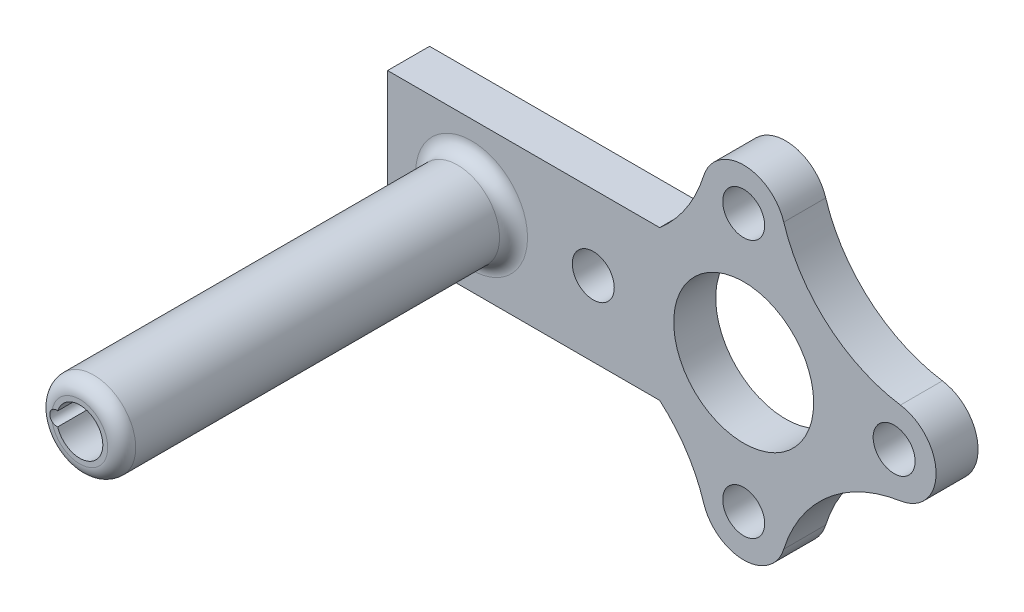
ISO-10303-21;
HEADER;
FILE_DESCRIPTION(('STEP AP214'),'2;1');
FILE_NAME('part.step','',(''),(''),'','','');
FILE_SCHEMA(('AUTOMOTIVE_DESIGN { 1 0 10303 214 1 1 1 1 }'));
ENDSEC;
DATA;
#1=APPLICATION_CONTEXT('core data for automotive mechanical design processes');
#2=APPLICATION_PROTOCOL_DEFINITION('international standard','automotive_design',2000,#1);
#3=PRODUCT_CONTEXT('',#1,'mechanical');
#4=PRODUCT('Part','Part','',(#3));
#5=PRODUCT_RELATED_PRODUCT_CATEGORY('part','',(#4));
#6=PRODUCT_DEFINITION_FORMATION('','',#4);
#7=PRODUCT_DEFINITION_CONTEXT('part definition',#1,'design');
#8=PRODUCT_DEFINITION('design','',#6,#7);
#9=PRODUCT_DEFINITION_SHAPE('','',#8);
#10=(LENGTH_UNIT() NAMED_UNIT(*) SI_UNIT(.MILLI.,.METRE.));
#11=(NAMED_UNIT(*) PLANE_ANGLE_UNIT() SI_UNIT($,.RADIAN.));
#12=(NAMED_UNIT(*) SI_UNIT($,.STERADIAN.) SOLID_ANGLE_UNIT());
#13=UNCERTAINTY_MEASURE_WITH_UNIT(LENGTH_MEASURE(1.E-05),#10,'distance_accuracy_value','');
#14=(GEOMETRIC_REPRESENTATION_CONTEXT(3) GLOBAL_UNCERTAINTY_ASSIGNED_CONTEXT((#13)) GLOBAL_UNIT_ASSIGNED_CONTEXT((#10,
#11,#12)) REPRESENTATION_CONTEXT('',''));
#15=CARTESIAN_POINT('',(0.,0.,0.));
#16=DIRECTION('',(0.,0.,1.));
#17=DIRECTION('',(1.,0.,0.));
#18=AXIS2_PLACEMENT_3D('',#15,#16,#17);
#19=CARTESIAN_POINT('',(-19.45,0.,0.));
#20=DIRECTION('',(0.,0.,1.));
#21=DIRECTION('',(1.,0.,0.));
#22=AXIS2_PLACEMENT_3D('',#19,#20,#21);
#23=CYLINDRICAL_SURFACE('',#22,1.65);
#24=CARTESIAN_POINT('',(-19.45,0.,2.));
#25=DIRECTION('',(0.,0.,-1.));
#26=DIRECTION('',(-1.,0.,0.));
#27=AXIS2_PLACEMENT_3D('',#24,#25,#26);
#28=CIRCLE('',#27,1.65);
#29=CARTESIAN_POINT('',(-21.0242424242424,-0.49422746758485,2.));
#30=VERTEX_POINT('',#29);
#31=CARTESIAN_POINT('',(-21.0242424242424,0.49422746758485,2.));
#32=VERTEX_POINT('',#31);
#33=EDGE_CURVE('E151',#30,#32,#28,.F.);
#34=ORIENTED_EDGE('',*,*,#33,.F.);
#35=DIRECTION('',(0.,0.,1.));
#36=VECTOR('',#35,1.);
#37=CARTESIAN_POINT('',(-21.0242424242424,-0.49422746758485,16.));
#38=LINE('',#37,#36);
#39=CARTESIAN_POINT('',(-21.0242424242424,-0.49422746758485,31.));
#40=VERTEX_POINT('',#39);
#41=EDGE_CURVE('E164',#30,#40,#38,.T.);
#42=ORIENTED_EDGE('',*,*,#41,.T.);
#43=CARTESIAN_POINT('',(-19.45,0.,31.));
#44=DIRECTION('',(0.,0.,1.));
#45=DIRECTION('',(1.,0.,0.));
#46=AXIS2_PLACEMENT_3D('',#43,#44,#45);
#47=CIRCLE('',#46,1.65);
#48=CARTESIAN_POINT('',(-21.0242424242424,0.49422746758485,31.));
#49=VERTEX_POINT('',#48);
#50=EDGE_CURVE('E173',#40,#49,#47,.T.);
#51=ORIENTED_EDGE('',*,*,#50,.T.);
#52=DIRECTION('',(0.,0.,1.));
#53=VECTOR('',#52,1.);
#54=CARTESIAN_POINT('',(-21.0242424242424,0.49422746758485,16.));
#55=LINE('',#54,#53);
#56=EDGE_CURVE('E166',#49,#32,#55,.F.);
#57=ORIENTED_EDGE('',*,*,#56,.T.);
#58=EDGE_LOOP('',(#34,#42,#51,#57));
#59=FACE_BOUND('',#58,.T.);
#60=ADVANCED_FACE('F46',(#59),#23,.F.);
#61=CARTESIAN_POINT('',(-21.1,0.,1.));
#62=DIRECTION('',(0.,0.,1.));
#63=DIRECTION('',(1.,0.,0.));
#64=AXIS2_PLACEMENT_3D('',#61,#62,#63);
#65=CYLINDRICAL_SURFACE('',#64,0.499999999999999);
#66=CARTESIAN_POINT('',(-21.1,0.,31.));
#67=DIRECTION('',(0.,0.,1.));
#68=DIRECTION('',(1.,0.,0.));
#69=AXIS2_PLACEMENT_3D('',#66,#67,#68);
#70=CIRCLE('',#69,0.499999999999999);
#71=CARTESIAN_POINT('',(-21.4113636363636,0.391219485647652,31.));
#72=VERTEX_POINT('',#71);
#73=EDGE_CURVE('E179',#49,#72,#70,.T.);
#74=ORIENTED_EDGE('',*,*,#73,.T.);
#75=CARTESIAN_POINT('',(-21.4113636363636,0.391219485647652,31.));
#76=CARTESIAN_POINT('',(-21.4333386085266,0.373759192446332,30.9999904788766));
#77=CARTESIAN_POINT('',(-21.4538006207845,0.354426202550446,30.9995066562345));
#78=CARTESIAN_POINT('',(-21.4911932018978,0.312645168823907,30.9980103081698));
#79=CARTESIAN_POINT('',(-21.5081265517639,0.290199601494244,30.9969982013206));
#80=CARTESIAN_POINT('',(-21.5379943465226,0.242791417093725,30.9948637190759));
#81=CARTESIAN_POINT('',(-21.5509283246198,0.217828506656292,30.9937413308287));
#82=CARTESIAN_POINT('',(-21.5724395578043,0.166087830484109,30.9917118296412));
#83=CARTESIAN_POINT('',(-21.5810176201198,0.139310402054949,30.9908046768305));
#84=CARTESIAN_POINT('',(-21.5935928420215,0.0845968457043598,30.9894317260018));
#85=CARTESIAN_POINT('',(-21.5975750850388,0.0566572480114473,30.988967365991));
#86=CARTESIAN_POINT('',(-21.600790074567,0.000500499319228724,30.988594598502));
#87=CARTESIAN_POINT('',(-21.6000225659482,-0.0277166665081785,30.988686220888));
#88=CARTESIAN_POINT('',(-21.5937813735543,-0.0834308114113578,30.9894017485214));
#89=CARTESIAN_POINT('',(-21.5883384303959,-0.110931288353157,30.9900221767058));
#90=CARTESIAN_POINT('',(-21.5729431739863,-0.164636629029002,30.9916441464587));
#91=CARTESIAN_POINT('',(-21.5629894092904,-0.190841072726625,30.9926458106807));
#92=CARTESIAN_POINT('',(-21.5388037995262,-0.241326751002398,30.9947751490887));
#93=CARTESIAN_POINT('',(-21.5245537342457,-0.265599226898945,30.9959033468351));
#94=CARTESIAN_POINT('',(-21.4921992443994,-0.311388276502147,30.9979256338297));
#95=CARTESIAN_POINT('',(-21.4741007384561,-0.332909001729001,30.9988200779183));
#96=CARTESIAN_POINT('',(-21.4407689563698,-0.366401510243679,30.9997681879898));
#97=CARTESIAN_POINT('',(-21.4264146654729,-0.379252491239132,30.9999974794818));
#98=CARTESIAN_POINT('',(-21.4113636363636,-0.391219485647658,31.));
#99=B_SPLINE_CURVE_WITH_KNOTS('',3,(#75,#76,#77,#78,#79,#80,#81,#82,#83,#84,#85,#86,#87,#88,#89,
#90,#91,#92,#93,#94,#95,#96,#97,#98),.UNSPECIFIED.,.F.,.F.,(4,2,2,2,2,2,2,2,2,2,2,4),(0.,
0.0840719847473638,0.168077457943229,0.252092732322253,0.336092431496281,0.420364006977041,
0.504640109086872,0.588366307009858,0.672119464616227,0.756232930839759,0.840217960367376,
0.897888808644791),.UNSPECIFIED.);
#100=CARTESIAN_POINT('',(-21.4113636363636,-0.391219485647652,31.));
#101=VERTEX_POINT('',#100);
#102=EDGE_CURVE('E56',#72,#101,#99,.T.);
#103=ORIENTED_EDGE('',*,*,#102,.T.);
#104=EDGE_CURVE('E168',#101,#40,#70,.T.);
#105=ORIENTED_EDGE('',*,*,#104,.T.);
#106=ORIENTED_EDGE('',*,*,#41,.F.);
#107=CARTESIAN_POINT('',(-21.1,0.,2.));
#108=DIRECTION('',(0.,0.,-1.));
#109=DIRECTION('',(-1.,0.,0.));
#110=AXIS2_PLACEMENT_3D('',#107,#108,#109);
#111=CIRCLE('',#110,0.499999999999999);
#112=CARTESIAN_POINT('',(-21.4113636363636,-0.391219485647664,2.));
#113=VERTEX_POINT('',#112);
#114=EDGE_CURVE('E147',#113,#30,#111,.F.);
#115=ORIENTED_EDGE('',*,*,#114,.F.);
#116=CARTESIAN_POINT('',(-21.4113636363636,-0.391219485647664,2.));
#117=CARTESIAN_POINT('',(-21.4308921485047,-0.375698748723737,1.98388420982419));
#118=CARTESIAN_POINT('',(-21.449723338062,-0.358300996107864,1.96854837000159));
#119=CARTESIAN_POINT('',(-21.485260021464,-0.31978413315132,1.93988834394156));
#120=CARTESIAN_POINT('',(-21.5019517323035,-0.298642797858754,1.92657710729837));
#121=CARTESIAN_POINT('',(-21.5299074837154,-0.256359666616134,1.90445735202498));
#122=CARTESIAN_POINT('',(-21.5416111051936,-0.235710531357668,1.89527167531953));
#123=CARTESIAN_POINT('',(-21.5621793458805,-0.192264734155432,1.87920859605277));
#124=CARTESIAN_POINT('',(-21.5710509214748,-0.169473515080711,1.87232553552208));
#125=CARTESIAN_POINT('',(-21.5855039651472,-0.12207882840306,1.86114633741173));
#126=CARTESIAN_POINT('',(-21.5910632709989,-0.0974643656635426,1.85686762134611));
#127=CARTESIAN_POINT('',(-21.5983973800872,-0.0473376368490403,1.85122833769585));
#128=CARTESIAN_POINT('',(-21.6001719641957,-0.0218253188769012,1.8498679390761));
#129=CARTESIAN_POINT('',(-21.5998206718191,0.0264742359867795,1.85013770315427));
#130=CARTESIAN_POINT('',(-21.5980833593503,0.0492673880406792,1.85146994372855));
#131=CARTESIAN_POINT('',(-21.5915797262114,0.0941445262998176,1.85647036834818));
#132=CARTESIAN_POINT('',(-21.586814165474,0.11622868896432,1.86013796634066));
#133=CARTESIAN_POINT('',(-21.5745638327234,0.159002766458833,1.86960504005227));
#134=CARTESIAN_POINT('',(-21.567093875793,0.179699563073462,1.87539290265807));
#135=CARTESIAN_POINT('',(-21.5498036471234,0.219423141026829,1.88886352023397));
#136=CARTESIAN_POINT('',(-21.5399823338818,0.238449177205474,1.89654711494002));
#137=CARTESIAN_POINT('',(-21.5172451067083,0.276493717182921,1.91445516320856));
#138=CARTESIAN_POINT('',(-21.5041106423672,0.295294109399724,1.92486340394062));
#139=CARTESIAN_POINT('',(-21.4760087112737,0.330336607620189,1.94732994676704));
#140=CARTESIAN_POINT('',(-21.4610413483606,0.346578858431284,1.95938815539022));
#141=CARTESIAN_POINT('',(-21.4343609934774,0.372069853678035,1.98109605184999));
#142=CARTESIAN_POINT('',(-21.4229897051886,0.381968568036632,1.99040755578535));
#143=CARTESIAN_POINT('',(-21.4113636363636,0.391219485647722,1.99999999999996));
#144=B_SPLINE_CURVE_WITH_KNOTS('',3,(#116,#117,#118,#119,#120,#121,#122,#123,#124,#125,#126,
#127,#128,#129,#130,#131,#132,#133,#134,#135,#136,#137,#138,#139,#140,#141,#142,#143),
.UNSPECIFIED.,.F.,.F.,(4,2,2,2,2,2,2,2,2,2,2,2,2,4),(0.,0.0891765680526609,0.178901486274257,
0.254930528184064,0.330771355916632,0.40711409241865,0.483461248897172,0.55182266918244,
0.620166941075376,0.688142341909253,0.756147907444155,0.831421336116651,0.906690502291091,
0.959765954082744),.UNSPECIFIED.);
#145=CARTESIAN_POINT('',(-21.4113636363636,0.391219485647664,2.));
#146=VERTEX_POINT('',#145);
#147=EDGE_CURVE('E335',#113,#146,#144,.T.);
#148=ORIENTED_EDGE('',*,*,#147,.T.);
#149=EDGE_CURVE('E157',#32,#146,#111,.F.);
#150=ORIENTED_EDGE('',*,*,#149,.F.);
#151=ORIENTED_EDGE('',*,*,#56,.F.);
#152=EDGE_LOOP('',(#74,#103,#105,#106,#115,#148,#150,#151));
#153=FACE_BOUND('',#152,.T.);
#154=ADVANCED_FACE('F171',(#153),#65,.F.);
#155=CARTESIAN_POINT('',(-12.7511833856394,-13.2080524548102,3.));
#156=DIRECTION('',(0.,0.,-1.));
#157=DIRECTION('',(-1.,0.,0.));
#158=AXIS2_PLACEMENT_3D('',#155,#156,#157);
#159=CYLINDRICAL_SURFACE('',#158,10.3587942791247);
#160=DIRECTION('',(0.,0.,-1.));
#161=VECTOR('',#160,1.);
#162=CARTESIAN_POINT('',(-6.00525389763348,-5.34694221133441,3.));
#163=LINE('',#162,#161);
#164=CARTESIAN_POINT('',(-6.00525389763348,-5.34694221133441,3.));
#165=VERTEX_POINT('',#164);
#166=CARTESIAN_POINT('',(-6.00525389763348,-5.34694221133441,0.));
#167=VERTEX_POINT('',#166);
#168=EDGE_CURVE('E214',#165,#167,#163,.T.);
#169=ORIENTED_EDGE('',*,*,#168,.T.);
#170=CARTESIAN_POINT('',(-12.7511833856394,-13.2080524548102,0.));
#171=DIRECTION('',(0.,0.,1.));
#172=DIRECTION('',(1.,0.,0.));
#173=AXIS2_PLACEMENT_3D('',#170,#171,#172);
#174=CIRCLE('',#173,10.3587942791247);
#175=CARTESIAN_POINT('',(-2.86354811352216,-10.1194787317447,0.));
#176=VERTEX_POINT('',#175);
#177=EDGE_CURVE('E210',#176,#167,#174,.T.);
#178=ORIENTED_EDGE('',*,*,#177,.F.);
#179=DIRECTION('',(0.,0.,-1.));
#180=VECTOR('',#179,1.);
#181=CARTESIAN_POINT('',(-2.86354811352216,-10.1194787317447,3.));
#182=LINE('',#181,#180);
#183=CARTESIAN_POINT('',(-2.86354811352216,-10.1194787317447,3.));
#184=VERTEX_POINT('',#183);
#185=EDGE_CURVE('E158',#184,#176,#182,.T.);
#186=ORIENTED_EDGE('',*,*,#185,.F.);
#187=CARTESIAN_POINT('',(-12.7511833856394,-13.2080524548102,3.));
#188=DIRECTION('',(0.,0.,1.));
#189=DIRECTION('',(1.,0.,0.));
#190=AXIS2_PLACEMENT_3D('',#187,#188,#189);
#191=CIRCLE('',#190,10.3587942791247);
#192=EDGE_CURVE('E220',#184,#165,#191,.T.);
#193=ORIENTED_EDGE('',*,*,#192,.T.);
#194=EDGE_LOOP('',(#169,#178,#186,#193));
#195=FACE_BOUND('',#194,.T.);
#196=ADVANCED_FACE('F359',(#195),#159,.F.);
#197=CARTESIAN_POINT('',(0.,-9.225,3.));
#198=DIRECTION('',(0.,0.,-1.));
#199=DIRECTION('',(-1.,0.,0.));
#200=AXIS2_PLACEMENT_3D('',#197,#198,#199);
#201=CYLINDRICAL_SURFACE('',#200,3.);
#202=CARTESIAN_POINT('',(0.,-9.225,0.));
#203=DIRECTION('',(0.,0.,1.));
#204=DIRECTION('',(1.,0.,0.));
#205=AXIS2_PLACEMENT_3D('',#202,#203,#204);
#206=CIRCLE('',#205,3.);
#207=CARTESIAN_POINT('',(2.86354811352216,-10.1194787317447,0.));
#208=VERTEX_POINT('',#207);
#209=EDGE_CURVE('E269',#176,#208,#206,.T.);
#210=ORIENTED_EDGE('',*,*,#209,.T.);
#211=DIRECTION('',(0.,0.,-1.));
#212=VECTOR('',#211,1.);
#213=CARTESIAN_POINT('',(2.86354811352216,-10.1194787317447,3.));
#214=LINE('',#213,#212);
#215=CARTESIAN_POINT('',(2.86354811352216,-10.1194787317447,3.));
#216=VERTEX_POINT('',#215);
#217=EDGE_CURVE('E323',#216,#208,#214,.T.);
#218=ORIENTED_EDGE('',*,*,#217,.F.);
#219=CARTESIAN_POINT('',(0.,-9.225,3.));
#220=DIRECTION('',(0.,0.,1.));
#221=DIRECTION('',(1.,0.,0.));
#222=AXIS2_PLACEMENT_3D('',#219,#220,#221);
#223=CIRCLE('',#222,3.);
#224=EDGE_CURVE('E223',#184,#216,#223,.T.);
#225=ORIENTED_EDGE('',*,*,#224,.F.);
#226=ORIENTED_EDGE('',*,*,#185,.T.);
#227=EDGE_LOOP('',(#210,#218,#225,#226));
#228=FACE_BOUND('',#227,.T.);
#229=ADVANCED_FACE('F438',(#228),#201,.T.);
#230=CARTESIAN_POINT('',(12.7511833856394,-13.2080524548102,3.));
#231=DIRECTION('',(0.,0.,-1.));
#232=DIRECTION('',(-1.,0.,0.));
#233=AXIS2_PLACEMENT_3D('',#230,#231,#232);
#234=CYLINDRICAL_SURFACE('',#233,10.3587942791247);
#235=CARTESIAN_POINT('',(12.7511833856394,-13.2080524548102,0.));
#236=DIRECTION('',(0.,0.,1.));
#237=DIRECTION('',(1.,0.,0.));
#238=AXIS2_PLACEMENT_3D('',#235,#236,#237);
#239=CIRCLE('',#238,10.3587942791247);
#240=CARTESIAN_POINT('',(11.1994080851518,-2.96614773283465,0.));
#241=VERTEX_POINT('',#240);
#242=EDGE_CURVE('E273',#241,#208,#239,.T.);
#243=ORIENTED_EDGE('',*,*,#242,.F.);
#244=DIRECTION('',(0.,0.,-1.));
#245=VECTOR('',#244,1.);
#246=CARTESIAN_POINT('',(11.1994080851518,-2.96614773283465,3.));
#247=LINE('',#246,#245);
#248=CARTESIAN_POINT('',(11.1994080851518,-2.96614773283465,3.));
#249=VERTEX_POINT('',#248);
#250=EDGE_CURVE('E320',#249,#241,#247,.T.);
#251=ORIENTED_EDGE('',*,*,#250,.F.);
#252=CARTESIAN_POINT('',(12.7511833856394,-13.2080524548102,3.));
#253=DIRECTION('',(0.,0.,1.));
#254=DIRECTION('',(1.,0.,0.));
#255=AXIS2_PLACEMENT_3D('',#252,#253,#254);
#256=CIRCLE('',#255,10.3587942791247);
#257=EDGE_CURVE('E227',#249,#216,#256,.T.);
#258=ORIENTED_EDGE('',*,*,#257,.T.);
#259=ORIENTED_EDGE('',*,*,#217,.T.);
#260=EDGE_LOOP('',(#243,#251,#258,#259));
#261=FACE_BOUND('',#260,.T.);
#262=ADVANCED_FACE('F435',(#261),#234,.F.);
#263=CARTESIAN_POINT('',(10.75,0.,3.));
#264=DIRECTION('',(0.,0.,-1.));
#265=DIRECTION('',(-1.,0.,0.));
#266=AXIS2_PLACEMENT_3D('',#263,#264,#265);
#267=CYLINDRICAL_SURFACE('',#266,3.);
#268=CARTESIAN_POINT('',(10.75,0.,0.));
#269=DIRECTION('',(0.,0.,1.));
#270=DIRECTION('',(1.,0.,0.));
#271=AXIS2_PLACEMENT_3D('',#268,#269,#270);
#272=CIRCLE('',#271,3.);
#273=CARTESIAN_POINT('',(11.1994080851518,2.96614773283466,0.));
#274=VERTEX_POINT('',#273);
#275=EDGE_CURVE('E277',#241,#274,#272,.T.);
#276=ORIENTED_EDGE('',*,*,#275,.T.);
#277=DIRECTION('',(0.,0.,-1.));
#278=VECTOR('',#277,1.);
#279=CARTESIAN_POINT('',(11.1994080851518,2.96614773283466,3.));
#280=LINE('',#279,#278);
#281=CARTESIAN_POINT('',(11.1994080851518,2.96614773283466,3.));
#282=VERTEX_POINT('',#281);
#283=EDGE_CURVE('E317',#282,#274,#280,.T.);
#284=ORIENTED_EDGE('',*,*,#283,.F.);
#285=CARTESIAN_POINT('',(10.75,0.,3.));
#286=DIRECTION('',(0.,0.,1.));
#287=DIRECTION('',(1.,0.,0.));
#288=AXIS2_PLACEMENT_3D('',#285,#286,#287);
#289=CIRCLE('',#288,3.);
#290=EDGE_CURVE('E231',#249,#282,#289,.T.);
#291=ORIENTED_EDGE('',*,*,#290,.F.);
#292=ORIENTED_EDGE('',*,*,#250,.T.);
#293=EDGE_LOOP('',(#276,#284,#291,#292));
#294=FACE_BOUND('',#293,.T.);
#295=ADVANCED_FACE('F431',(#294),#267,.T.);
#296=CARTESIAN_POINT('',(12.7511833856394,13.2080524548101,3.));
#297=DIRECTION('',(0.,0.,-1.));
#298=DIRECTION('',(-1.,0.,0.));
#299=AXIS2_PLACEMENT_3D('',#296,#297,#298);
#300=CYLINDRICAL_SURFACE('',#299,10.3587942791247);
#301=CARTESIAN_POINT('',(12.7511833856394,13.2080524548101,0.));
#302=DIRECTION('',(0.,0.,1.));
#303=DIRECTION('',(1.,0.,0.));
#304=AXIS2_PLACEMENT_3D('',#301,#302,#303);
#305=CIRCLE('',#304,10.3587942791247);
#306=CARTESIAN_POINT('',(2.86354811352216,10.1194787317447,0.));
#307=VERTEX_POINT('',#306);
#308=EDGE_CURVE('E281',#307,#274,#305,.T.);
#309=ORIENTED_EDGE('',*,*,#308,.F.);
#310=DIRECTION('',(0.,0.,-1.));
#311=VECTOR('',#310,1.);
#312=CARTESIAN_POINT('',(2.86354811352216,10.1194787317447,3.));
#313=LINE('',#312,#311);
#314=CARTESIAN_POINT('',(2.86354811352216,10.1194787317447,3.));
#315=VERTEX_POINT('',#314);
#316=EDGE_CURVE('E314',#315,#307,#313,.T.);
#317=ORIENTED_EDGE('',*,*,#316,.F.);
#318=CARTESIAN_POINT('',(12.7511833856394,13.2080524548101,3.));
#319=DIRECTION('',(0.,0.,1.));
#320=DIRECTION('',(1.,0.,0.));
#321=AXIS2_PLACEMENT_3D('',#318,#319,#320);
#322=CIRCLE('',#321,10.3587942791247);
#323=EDGE_CURVE('E234',#315,#282,#322,.T.);
#324=ORIENTED_EDGE('',*,*,#323,.T.);
#325=ORIENTED_EDGE('',*,*,#283,.T.);
#326=EDGE_LOOP('',(#309,#317,#324,#325));
#327=FACE_BOUND('',#326,.T.);
#328=ADVANCED_FACE('F427',(#327),#300,.F.);
#329=CARTESIAN_POINT('',(0.,9.225,3.));
#330=DIRECTION('',(0.,0.,-1.));
#331=DIRECTION('',(-1.,0.,0.));
#332=AXIS2_PLACEMENT_3D('',#329,#330,#331);
#333=CYLINDRICAL_SURFACE('',#332,3.);
#334=CARTESIAN_POINT('',(0.,9.225,0.));
#335=DIRECTION('',(0.,0.,1.));
#336=DIRECTION('',(1.,0.,0.));
#337=AXIS2_PLACEMENT_3D('',#334,#335,#336);
#338=CIRCLE('',#337,3.);
#339=CARTESIAN_POINT('',(-2.86354811352216,10.1194787317447,0.));
#340=VERTEX_POINT('',#339);
#341=EDGE_CURVE('E285',#307,#340,#338,.T.);
#342=ORIENTED_EDGE('',*,*,#341,.T.);
#343=DIRECTION('',(0.,0.,-1.));
#344=VECTOR('',#343,1.);
#345=CARTESIAN_POINT('',(-2.86354811352216,10.1194787317447,3.));
#346=LINE('',#345,#344);
#347=CARTESIAN_POINT('',(-2.86354811352216,10.1194787317447,3.));
#348=VERTEX_POINT('',#347);
#349=EDGE_CURVE('E265',#348,#340,#346,.T.);
#350=ORIENTED_EDGE('',*,*,#349,.F.);
#351=CARTESIAN_POINT('',(0.,9.225,3.));
#352=DIRECTION('',(0.,0.,1.));
#353=DIRECTION('',(1.,0.,0.));
#354=AXIS2_PLACEMENT_3D('',#351,#352,#353);
#355=CIRCLE('',#354,3.);
#356=EDGE_CURVE('E238',#315,#348,#355,.T.);
#357=ORIENTED_EDGE('',*,*,#356,.F.);
#358=ORIENTED_EDGE('',*,*,#316,.T.);
#359=EDGE_LOOP('',(#342,#350,#357,#358));
#360=FACE_BOUND('',#359,.T.);
#361=ADVANCED_FACE('F423',(#360),#333,.T.);
#362=CARTESIAN_POINT('',(-12.7511833856394,13.2080524548102,3.));
#363=DIRECTION('',(0.,0.,-1.));
#364=DIRECTION('',(-1.,0.,0.));
#365=AXIS2_PLACEMENT_3D('',#362,#363,#364);
#366=CYLINDRICAL_SURFACE('',#365,10.3587942791247);
#367=DIRECTION('',(0.,0.,-1.));
#368=VECTOR('',#367,1.);
#369=CARTESIAN_POINT('',(-6.00525389763347,5.34694221133441,3.));
#370=LINE('',#369,#368);
#371=CARTESIAN_POINT('',(-6.00525389763347,5.34694221133441,3.));
#372=VERTEX_POINT('',#371);
#373=CARTESIAN_POINT('',(-6.00525389763347,5.34694221133441,0.));
#374=VERTEX_POINT('',#373);
#375=EDGE_CURVE('E196',#372,#374,#370,.T.);
#376=ORIENTED_EDGE('',*,*,#375,.F.);
#377=CARTESIAN_POINT('',(-12.7511833856394,13.2080524548102,3.));
#378=DIRECTION('',(0.,0.,1.));
#379=DIRECTION('',(1.,0.,0.));
#380=AXIS2_PLACEMENT_3D('',#377,#378,#379);
#381=CIRCLE('',#380,10.3587942791247);
#382=EDGE_CURVE('E242',#372,#348,#381,.T.);
#383=ORIENTED_EDGE('',*,*,#382,.T.);
#384=ORIENTED_EDGE('',*,*,#349,.T.);
#385=CARTESIAN_POINT('',(-12.7511833856394,13.2080524548102,0.));
#386=DIRECTION('',(0.,0.,1.));
#387=DIRECTION('',(1.,0.,0.));
#388=AXIS2_PLACEMENT_3D('',#385,#386,#387);
#389=CIRCLE('',#388,10.3587942791247);
#390=EDGE_CURVE('E289',#374,#340,#389,.T.);
#391=ORIENTED_EDGE('',*,*,#390,.F.);
#392=EDGE_LOOP('',(#376,#383,#384,#391));
#393=FACE_BOUND('',#392,.T.);
#394=ADVANCED_FACE('F409',(#393),#366,.F.);
#395=CARTESIAN_POINT('',(0.,9.225,3.));
#396=DIRECTION('',(0.,0.,-1.));
#397=DIRECTION('',(-1.,0.,0.));
#398=AXIS2_PLACEMENT_3D('',#395,#396,#397);
#399=CYLINDRICAL_SURFACE('',#398,1.5);
#400=CARTESIAN_POINT('',(0.,9.225,3.));
#401=DIRECTION('',(0.,0.,1.));
#402=DIRECTION('',(1.,0.,0.));
#403=AXIS2_PLACEMENT_3D('',#400,#401,#402);
#404=CIRCLE('',#403,1.5);
#405=CARTESIAN_POINT('',(1.5,9.225,3.));
#406=VERTEX_POINT('',#405);
#407=EDGE_CURVE('E257',#406,#406,#404,.T.);
#408=ORIENTED_EDGE('',*,*,#407,.T.);
#409=EDGE_LOOP('',(#408));
#410=FACE_BOUND('',#409,.T.);
#411=CARTESIAN_POINT('',(0.,9.225,0.));
#412=DIRECTION('',(0.,0.,1.));
#413=DIRECTION('',(1.,0.,0.));
#414=AXIS2_PLACEMENT_3D('',#411,#412,#413);
#415=CIRCLE('',#414,1.5);
#416=CARTESIAN_POINT('',(1.5,9.225,0.));
#417=VERTEX_POINT('',#416);
#418=EDGE_CURVE('E304',#417,#417,#415,.T.);
#419=ORIENTED_EDGE('',*,*,#418,.F.);
#420=EDGE_LOOP('',(#419));
#421=FACE_BOUND('',#420,.T.);
#422=ADVANCED_FACE('F405',(#410,#421),#399,.F.);
#423=CARTESIAN_POINT('',(-10.75,0.,3.));
#424=DIRECTION('',(0.,0.,-1.));
#425=DIRECTION('',(-1.,0.,0.));
#426=AXIS2_PLACEMENT_3D('',#423,#424,#425);
#427=CYLINDRICAL_SURFACE('',#426,1.5);
#428=CARTESIAN_POINT('',(-10.75,0.,3.));
#429=DIRECTION('',(0.,0.,1.));
#430=DIRECTION('',(1.,0.,0.));
#431=AXIS2_PLACEMENT_3D('',#428,#429,#430);
#432=CIRCLE('',#431,1.5);
#433=CARTESIAN_POINT('',(-9.25,0.,3.));
#434=VERTEX_POINT('',#433);
#435=EDGE_CURVE('E253',#434,#434,#432,.T.);
#436=ORIENTED_EDGE('',*,*,#435,.T.);
#437=EDGE_LOOP('',(#436));
#438=FACE_BOUND('',#437,.T.);
#439=CARTESIAN_POINT('',(-10.75,0.,0.));
#440=DIRECTION('',(0.,0.,1.));
#441=DIRECTION('',(1.,0.,0.));
#442=AXIS2_PLACEMENT_3D('',#439,#440,#441);
#443=CIRCLE('',#442,1.5);
#444=CARTESIAN_POINT('',(-9.25,0.,0.));
#445=VERTEX_POINT('',#444);
#446=EDGE_CURVE('E300',#445,#445,#443,.T.);
#447=ORIENTED_EDGE('',*,*,#446,.F.);
#448=EDGE_LOOP('',(#447));
#449=FACE_BOUND('',#448,.T.);
#450=ADVANCED_FACE('F408',(#438,#449),#427,.F.);
#451=CARTESIAN_POINT('',(0.,0.,3.));
#452=DIRECTION('',(0.,0.,-1.));
#453=DIRECTION('',(-1.,0.,0.));
#454=AXIS2_PLACEMENT_3D('',#451,#452,#453);
#455=CYLINDRICAL_SURFACE('',#454,5.);
#456=CARTESIAN_POINT('',(0.,0.,3.));
#457=DIRECTION('',(0.,0.,1.));
#458=DIRECTION('',(1.,0.,0.));
#459=AXIS2_PLACEMENT_3D('',#456,#457,#458);
#460=CIRCLE('',#459,5.);
#461=CARTESIAN_POINT('',(5.,0.,3.));
#462=VERTEX_POINT('',#461);
#463=EDGE_CURVE('E249',#462,#462,#460,.T.);
#464=ORIENTED_EDGE('',*,*,#463,.T.);
#465=EDGE_LOOP('',(#464));
#466=FACE_BOUND('',#465,.T.);
#467=CARTESIAN_POINT('',(0.,0.,0.));
#468=DIRECTION('',(0.,0.,1.));
#469=DIRECTION('',(1.,0.,0.));
#470=AXIS2_PLACEMENT_3D('',#467,#468,#469);
#471=CIRCLE('',#470,5.);
#472=CARTESIAN_POINT('',(5.,0.,0.));
#473=VERTEX_POINT('',#472);
#474=EDGE_CURVE('E296',#473,#473,#471,.T.);
#475=ORIENTED_EDGE('',*,*,#474,.F.);
#476=EDGE_LOOP('',(#475));
#477=FACE_BOUND('',#476,.T.);
#478=ADVANCED_FACE('F413',(#466,#477),#455,.F.);
#479=CARTESIAN_POINT('',(0.,-9.225,3.));
#480=DIRECTION('',(0.,0.,-1.));
#481=DIRECTION('',(-1.,0.,0.));
#482=AXIS2_PLACEMENT_3D('',#479,#480,#481);
#483=CYLINDRICAL_SURFACE('',#482,1.5);
#484=CARTESIAN_POINT('',(0.,-9.225,3.));
#485=DIRECTION('',(0.,0.,1.));
#486=DIRECTION('',(1.,0.,0.));
#487=AXIS2_PLACEMENT_3D('',#484,#485,#486);
#488=CIRCLE('',#487,1.5);
#489=CARTESIAN_POINT('',(1.5,-9.225,3.));
#490=VERTEX_POINT('',#489);
#491=EDGE_CURVE('E245',#490,#490,#488,.T.);
#492=ORIENTED_EDGE('',*,*,#491,.T.);
#493=EDGE_LOOP('',(#492));
#494=FACE_BOUND('',#493,.T.);
#495=CARTESIAN_POINT('',(0.,-9.225,0.));
#496=DIRECTION('',(0.,0.,1.));
#497=DIRECTION('',(1.,0.,0.));
#498=AXIS2_PLACEMENT_3D('',#495,#496,#497);
#499=CIRCLE('',#498,1.5);
#500=CARTESIAN_POINT('',(1.5,-9.225,0.));
#501=VERTEX_POINT('',#500);
#502=EDGE_CURVE('E292',#501,#501,#499,.T.);
#503=ORIENTED_EDGE('',*,*,#502,.F.);
#504=EDGE_LOOP('',(#503));
#505=FACE_BOUND('',#504,.T.);
#506=ADVANCED_FACE('F403',(#494,#505),#483,.F.);
#507=CARTESIAN_POINT('',(10.75,0.,3.));
#508=DIRECTION('',(0.,0.,-1.));
#509=DIRECTION('',(-1.,0.,0.));
#510=AXIS2_PLACEMENT_3D('',#507,#508,#509);
#511=CYLINDRICAL_SURFACE('',#510,1.5);
#512=CARTESIAN_POINT('',(10.75,0.,3.));
#513=DIRECTION('',(0.,0.,1.));
#514=DIRECTION('',(1.,0.,0.));
#515=AXIS2_PLACEMENT_3D('',#512,#513,#514);
#516=CIRCLE('',#515,1.5);
#517=CARTESIAN_POINT('',(12.25,0.,3.));
#518=VERTEX_POINT('',#517);
#519=EDGE_CURVE('E261',#518,#518,#516,.T.);
#520=ORIENTED_EDGE('',*,*,#519,.T.);
#521=EDGE_LOOP('',(#520));
#522=FACE_BOUND('',#521,.T.);
#523=CARTESIAN_POINT('',(10.75,0.,0.));
#524=DIRECTION('',(0.,0.,1.));
#525=DIRECTION('',(1.,0.,0.));
#526=AXIS2_PLACEMENT_3D('',#523,#524,#525);
#527=CIRCLE('',#526,1.5);
#528=CARTESIAN_POINT('',(12.25,0.,0.));
#529=VERTEX_POINT('',#528);
#530=EDGE_CURVE('E224',#529,#529,#527,.T.);
#531=ORIENTED_EDGE('',*,*,#530,.F.);
#532=EDGE_LOOP('',(#531));
#533=FACE_BOUND('',#532,.T.);
#534=ADVANCED_FACE('F396',(#522,#533),#511,.F.);
#535=CARTESIAN_POINT('',(0.,0.,3.));
#536=DIRECTION('',(0.,0.,1.));
#537=DIRECTION('',(1.,0.,0.));
#538=AXIS2_PLACEMENT_3D('',#535,#536,#537);
#539=PLANE('',#538);
#540=CARTESIAN_POINT('',(-19.45,0.,3.));
#541=DIRECTION('',(0.,0.,1.));
#542=DIRECTION('',(1.,0.,0.));
#543=AXIS2_PLACEMENT_3D('',#540,#541,#542);
#544=CIRCLE('',#543,4.);
#545=CARTESIAN_POINT('',(-15.45,0.,3.));
#546=VERTEX_POINT('',#545);
#547=EDGE_CURVE('E742',#546,#546,#544,.F.);
#548=ORIENTED_EDGE('',*,*,#547,.T.);
#549=EDGE_LOOP('',(#548));
#550=FACE_BOUND('',#549,.T.);
#551=ORIENTED_EDGE('',*,*,#382,.F.);
#552=DIRECTION('',(1.,0.,0.));
#553=VECTOR('',#552,1.);
#554=CARTESIAN_POINT('',(-6.00525389763347,5.34694221133441,3.));
#555=LINE('',#554,#553);
#556=CARTESIAN_POINT('',(-25.45,5.34694221133441,3.));
#557=VERTEX_POINT('',#556);
#558=EDGE_CURVE('E183',#557,#372,#555,.T.);
#559=ORIENTED_EDGE('',*,*,#558,.F.);
#560=DIRECTION('',(0.,1.,0.));
#561=VECTOR('',#560,1.);
#562=CARTESIAN_POINT('',(-25.45,5.34694221133441,3.));
#563=LINE('',#562,#561);
#564=CARTESIAN_POINT('',(-25.45,-5.3469422113344,3.));
#565=VERTEX_POINT('',#564);
#566=EDGE_CURVE('E192',#565,#557,#563,.T.);
#567=ORIENTED_EDGE('',*,*,#566,.F.);
#568=DIRECTION('',(-1.,0.,0.));
#569=VECTOR('',#568,1.);
#570=CARTESIAN_POINT('',(-6.00525389763348,-5.34694221133441,3.));
#571=LINE('',#570,#569);
#572=EDGE_CURVE('E187',#165,#565,#571,.T.);
#573=ORIENTED_EDGE('',*,*,#572,.F.);
#574=ORIENTED_EDGE('',*,*,#192,.F.);
#575=ORIENTED_EDGE('',*,*,#224,.T.);
#576=ORIENTED_EDGE('',*,*,#257,.F.);
#577=ORIENTED_EDGE('',*,*,#290,.T.);
#578=ORIENTED_EDGE('',*,*,#323,.F.);
#579=ORIENTED_EDGE('',*,*,#356,.T.);
#580=EDGE_LOOP('',(#551,#559,#567,#573,#574,#575,#576,#577,#578,#579));
#581=FACE_BOUND('',#580,.T.);
#582=ORIENTED_EDGE('',*,*,#491,.F.);
#583=EDGE_LOOP('',(#582));
#584=FACE_BOUND('',#583,.T.);
#585=ORIENTED_EDGE('',*,*,#463,.F.);
#586=EDGE_LOOP('',(#585));
#587=FACE_BOUND('',#586,.T.);
#588=ORIENTED_EDGE('',*,*,#407,.F.);
#589=EDGE_LOOP('',(#588));
#590=FACE_BOUND('',#589,.T.);
#591=ORIENTED_EDGE('',*,*,#519,.F.);
#592=EDGE_LOOP('',(#591));
#593=FACE_BOUND('',#592,.T.);
#594=ORIENTED_EDGE('',*,*,#435,.F.);
#595=EDGE_LOOP('',(#594));
#596=FACE_BOUND('',#595,.T.);
#597=ADVANCED_FACE('F393',(#550,#581,#584,#587,#590,#593,#596),#539,.T.);
#598=CARTESIAN_POINT('',(0.,0.,0.));
#599=DIRECTION('',(0.,0.,1.));
#600=DIRECTION('',(1.,0.,0.));
#601=AXIS2_PLACEMENT_3D('',#598,#599,#600);
#602=PLANE('',#601);
#603=CARTESIAN_POINT('',(-19.45,0.,0.));
#604=DIRECTION('',(0.,0.,-1.));
#605=DIRECTION('',(-1.,0.,0.));
#606=AXIS2_PLACEMENT_3D('',#603,#604,#605);
#607=CIRCLE('',#606,3.);
#608=CARTESIAN_POINT('',(-22.45,0.,0.));
#609=VERTEX_POINT('',#608);
#610=EDGE_CURVE('E169',#609,#609,#607,.T.);
#611=ORIENTED_EDGE('',*,*,#610,.F.);
#612=EDGE_LOOP('',(#611));
#613=FACE_BOUND('',#612,.T.);
#614=DIRECTION('',(1.,0.,0.));
#615=VECTOR('',#614,1.);
#616=CARTESIAN_POINT('',(-6.00525389763347,5.34694221133441,0.));
#617=LINE('',#616,#615);
#618=CARTESIAN_POINT('',(-25.45,5.34694221133441,0.));
#619=VERTEX_POINT('',#618);
#620=EDGE_CURVE('E177',#619,#374,#617,.T.);
#621=ORIENTED_EDGE('',*,*,#620,.T.);
#622=ORIENTED_EDGE('',*,*,#390,.T.);
#623=ORIENTED_EDGE('',*,*,#341,.F.);
#624=ORIENTED_EDGE('',*,*,#308,.T.);
#625=ORIENTED_EDGE('',*,*,#275,.F.);
#626=ORIENTED_EDGE('',*,*,#242,.T.);
#627=ORIENTED_EDGE('',*,*,#209,.F.);
#628=ORIENTED_EDGE('',*,*,#177,.T.);
#629=DIRECTION('',(-1.,0.,0.));
#630=VECTOR('',#629,1.);
#631=CARTESIAN_POINT('',(-6.00525389763348,-5.34694221133441,0.));
#632=LINE('',#631,#630);
#633=CARTESIAN_POINT('',(-25.45,-5.3469422113344,0.));
#634=VERTEX_POINT('',#633);
#635=EDGE_CURVE('E200',#167,#634,#632,.T.);
#636=ORIENTED_EDGE('',*,*,#635,.T.);
#637=DIRECTION('',(0.,1.,0.));
#638=VECTOR('',#637,1.);
#639=CARTESIAN_POINT('',(-25.45,5.34694221133441,0.));
#640=LINE('',#639,#638);
#641=EDGE_CURVE('E188',#634,#619,#640,.T.);
#642=ORIENTED_EDGE('',*,*,#641,.T.);
#643=EDGE_LOOP('',(#621,#622,#623,#624,#625,#626,#627,#628,#636,#642));
#644=FACE_BOUND('',#643,.T.);
#645=ORIENTED_EDGE('',*,*,#502,.T.);
#646=EDGE_LOOP('',(#645));
#647=FACE_BOUND('',#646,.T.);
#648=ORIENTED_EDGE('',*,*,#474,.T.);
#649=EDGE_LOOP('',(#648));
#650=FACE_BOUND('',#649,.T.);
#651=ORIENTED_EDGE('',*,*,#418,.T.);
#652=EDGE_LOOP('',(#651));
#653=FACE_BOUND('',#652,.T.);
#654=ORIENTED_EDGE('',*,*,#530,.T.);
#655=EDGE_LOOP('',(#654));
#656=FACE_BOUND('',#655,.T.);
#657=ORIENTED_EDGE('',*,*,#446,.T.);
#658=EDGE_LOOP('',(#657));
#659=FACE_BOUND('',#658,.T.);
#660=ADVANCED_FACE('F391',(#613,#644,#647,#650,#653,#656,#659),#602,.F.);
#661=CARTESIAN_POINT('',(-6.00525389763347,5.34694221133441,3.));
#662=DIRECTION('',(0.,1.,0.));
#663=DIRECTION('',(-1.,0.,0.));
#664=AXIS2_PLACEMENT_3D('',#661,#662,#663);
#665=PLANE('',#664);
#666=ORIENTED_EDGE('',*,*,#620,.F.);
#667=DIRECTION('',(0.,0.,-1.));
#668=VECTOR('',#667,1.);
#669=CARTESIAN_POINT('',(-25.45,5.34694221133441,3.));
#670=LINE('',#669,#668);
#671=EDGE_CURVE('E207',#557,#619,#670,.T.);
#672=ORIENTED_EDGE('',*,*,#671,.F.);
#673=ORIENTED_EDGE('',*,*,#558,.T.);
#674=ORIENTED_EDGE('',*,*,#375,.T.);
#675=EDGE_LOOP('',(#666,#672,#673,#674));
#676=FACE_BOUND('',#675,.T.);
#677=ADVANCED_FACE('F384',(#676),#665,.T.);
#678=CARTESIAN_POINT('',(-25.45,5.34694221133441,3.));
#679=DIRECTION('',(-1.,0.,0.));
#680=DIRECTION('',(0.,-1.,0.));
#681=AXIS2_PLACEMENT_3D('',#678,#679,#680);
#682=PLANE('',#681);
#683=ORIENTED_EDGE('',*,*,#641,.F.);
#684=DIRECTION('',(0.,0.,-1.));
#685=VECTOR('',#684,1.);
#686=CARTESIAN_POINT('',(-25.45,-5.3469422113344,3.));
#687=LINE('',#686,#685);
#688=EDGE_CURVE('E211',#565,#634,#687,.T.);
#689=ORIENTED_EDGE('',*,*,#688,.F.);
#690=ORIENTED_EDGE('',*,*,#566,.T.);
#691=ORIENTED_EDGE('',*,*,#671,.T.);
#692=EDGE_LOOP('',(#683,#689,#690,#691));
#693=FACE_BOUND('',#692,.T.);
#694=ADVANCED_FACE('F381',(#693),#682,.T.);
#695=CARTESIAN_POINT('',(-6.00525389763348,-5.34694221133441,3.));
#696=DIRECTION('',(0.,-1.,0.));
#697=DIRECTION('',(1.,0.,0.));
#698=AXIS2_PLACEMENT_3D('',#695,#696,#697);
#699=PLANE('',#698);
#700=ORIENTED_EDGE('',*,*,#635,.F.);
#701=ORIENTED_EDGE('',*,*,#168,.F.);
#702=ORIENTED_EDGE('',*,*,#572,.T.);
#703=ORIENTED_EDGE('',*,*,#688,.T.);
#704=EDGE_LOOP('',(#700,#701,#702,#703));
#705=FACE_BOUND('',#704,.T.);
#706=ADVANCED_FACE('F379',(#705),#699,.T.);
#707=CARTESIAN_POINT('',(-19.45,0.,0.));
#708=DIRECTION('',(0.,0.,1.));
#709=DIRECTION('',(1.,0.,0.));
#710=AXIS2_PLACEMENT_3D('',#707,#708,#709);
#711=CYLINDRICAL_SURFACE('',#710,3.);
#712=CARTESIAN_POINT('',(-19.45,0.,30.));
#713=DIRECTION('',(0.,0.,1.));
#714=DIRECTION('',(1.,0.,0.));
#715=AXIS2_PLACEMENT_3D('',#712,#713,#714);
#716=CIRCLE('',#715,3.);
#717=CARTESIAN_POINT('',(-16.45,0.,30.));
#718=VERTEX_POINT('',#717);
#719=EDGE_CURVE('E11',#718,#718,#716,.F.);
#720=ORIENTED_EDGE('',*,*,#719,.T.);
#721=EDGE_LOOP('',(#720));
#722=FACE_BOUND('',#721,.T.);
#723=CARTESIAN_POINT('',(-19.45,0.,4.));
#724=DIRECTION('',(0.,0.,1.));
#725=DIRECTION('',(1.,0.,0.));
#726=AXIS2_PLACEMENT_3D('',#723,#724,#725);
#727=CIRCLE('',#726,3.);
#728=CARTESIAN_POINT('',(-16.45,0.,4.));
#729=VERTEX_POINT('',#728);
#730=EDGE_CURVE('E344',#729,#729,#727,.T.);
#731=ORIENTED_EDGE('',*,*,#730,.T.);
#732=EDGE_LOOP('',(#731));
#733=FACE_BOUND('',#732,.T.);
#734=ADVANCED_FACE('F376',(#722,#733),#711,.T.);
#735=CARTESIAN_POINT('',(-19.45,0.,31.));
#736=DIRECTION('',(0.,0.,1.));
#737=DIRECTION('',(1.,0.,0.));
#738=AXIS2_PLACEMENT_3D('',#735,#736,#737);
#739=PLANE('',#738);
#740=ORIENTED_EDGE('',*,*,#104,.F.);
#741=CARTESIAN_POINT('',(-19.45,0.,31.));
#742=DIRECTION('',(0.,0.,1.));
#743=DIRECTION('',(1.,0.,0.));
#744=AXIS2_PLACEMENT_3D('',#741,#742,#743);
#745=CIRCLE('',#744,2.);
#746=EDGE_CURVE('E740',#101,#72,#745,.T.);
#747=ORIENTED_EDGE('',*,*,#746,.T.);
#748=ORIENTED_EDGE('',*,*,#73,.F.);
#749=ORIENTED_EDGE('',*,*,#50,.F.);
#750=EDGE_LOOP('',(#740,#747,#748,#749));
#751=FACE_BOUND('',#750,.T.);
#752=ADVANCED_FACE('F375',(#751),#739,.T.);
#753=CARTESIAN_POINT('',(-19.45,0.,2.));
#754=DIRECTION('',(0.,0.,-1.));
#755=DIRECTION('',(-1.,0.,0.));
#756=AXIS2_PLACEMENT_3D('',#753,#754,#755);
#757=PLANE('',#756);
#758=ORIENTED_EDGE('',*,*,#149,.T.);
#759=CARTESIAN_POINT('',(-19.45,0.,2.));
#760=DIRECTION('',(0.,0.,-1.));
#761=DIRECTION('',(-1.,0.,0.));
#762=AXIS2_PLACEMENT_3D('',#759,#760,#761);
#763=CIRCLE('',#762,1.99999999999998);
#764=EDGE_CURVE('E154',#146,#113,#763,.T.);
#765=ORIENTED_EDGE('',*,*,#764,.T.);
#766=ORIENTED_EDGE('',*,*,#114,.T.);
#767=ORIENTED_EDGE('',*,*,#33,.T.);
#768=EDGE_LOOP('',(#758,#765,#766,#767));
#769=FACE_BOUND('',#768,.T.);
#770=ADVANCED_FACE('F150',(#769),#757,.T.);
#771=CARTESIAN_POINT('',(-19.45,0.,2.));
#772=DIRECTION('',(0.,0.,-1.));
#773=DIRECTION('',(-1.,0.,0.));
#774=AXIS2_PLACEMENT_3D('',#771,#772,#773);
#775=CYLINDRICAL_SURFACE('',#774,3.);
#776=CARTESIAN_POINT('',(-19.45,0.,1.));
#777=DIRECTION('',(0.,0.,-1.));
#778=DIRECTION('',(-1.,0.,0.));
#779=AXIS2_PLACEMENT_3D('',#776,#777,#778);
#780=CIRCLE('',#779,3.);
#781=CARTESIAN_POINT('',(-22.45,0.,1.));
#782=VERTEX_POINT('',#781);
#783=EDGE_CURVE('E331',#782,#782,#780,.F.);
#784=ORIENTED_EDGE('',*,*,#783,.T.);
#785=EDGE_LOOP('',(#784));
#786=FACE_BOUND('',#785,.T.);
#787=ORIENTED_EDGE('',*,*,#610,.T.);
#788=EDGE_LOOP('',(#787));
#789=FACE_BOUND('',#788,.T.);
#790=ADVANCED_FACE('F357',(#786,#789),#775,.F.);
#791=CARTESIAN_POINT('',(-19.45,0.,2.));
#792=DIRECTION('',(0.,0.,-1.));
#793=DIRECTION('',(-1.,0.,0.));
#794=AXIS2_PLACEMENT_3D('',#791,#792,#793);
#795=CONICAL_SURFACE('',#794,1.99999999999998,0.785398163397455);
#796=ORIENTED_EDGE('',*,*,#783,.F.);
#797=EDGE_LOOP('',(#796));
#798=FACE_BOUND('',#797,.T.);
#799=ORIENTED_EDGE('',*,*,#147,.F.);
#800=ORIENTED_EDGE('',*,*,#764,.F.);
#801=EDGE_LOOP('',(#799,#800));
#802=FACE_BOUND('',#801,.T.);
#803=ADVANCED_FACE('F350',(#798,#802),#795,.F.);
#804=CARTESIAN_POINT('',(-19.45,0.,4.));
#805=DIRECTION('',(0.,0.,1.));
#806=DIRECTION('',(1.,0.,0.));
#807=AXIS2_PLACEMENT_3D('',#804,#805,#806);
#808=TOROIDAL_SURFACE('',#807,4.,1.);
#809=ORIENTED_EDGE('',*,*,#547,.F.);
#810=EDGE_LOOP('',(#809));
#811=FACE_BOUND('',#810,.T.);
#812=ORIENTED_EDGE('',*,*,#730,.F.);
#813=EDGE_LOOP('',(#812));
#814=FACE_BOUND('',#813,.T.);
#815=ADVANCED_FACE('F356',(#811,#814),#808,.F.);
#816=CARTESIAN_POINT('',(-19.45,0.,30.));
#817=DIRECTION('',(0.,0.,1.));
#818=DIRECTION('',(1.,0.,0.));
#819=AXIS2_PLACEMENT_3D('',#816,#817,#818);
#820=TOROIDAL_SURFACE('',#819,2.,1.);
#821=ORIENTED_EDGE('',*,*,#719,.F.);
#822=EDGE_LOOP('',(#821));
#823=FACE_BOUND('',#822,.T.);
#824=ORIENTED_EDGE('',*,*,#102,.F.);
#825=ORIENTED_EDGE('',*,*,#746,.F.);
#826=EDGE_LOOP('',(#824,#825));
#827=FACE_BOUND('',#826,.T.);
#828=ADVANCED_FACE('F48',(#823,#827),#820,.T.);
#829=CLOSED_SHELL('',(#60,#154,#196,#229,#262,#295,#328,#361,#394,#422,#450,#478,#506,#534,#597,
#660,#677,#694,#706,#734,#752,#770,#790,#803,#815,#828));
#830=MANIFOLD_SOLID_BREP('B2',#829);
#831=ADVANCED_BREP_SHAPE_REPRESENTATION('',(#18,#830),#14);
#832=SHAPE_DEFINITION_REPRESENTATION(#9,#831);
ENDSEC;
END-ISO-10303-21;
